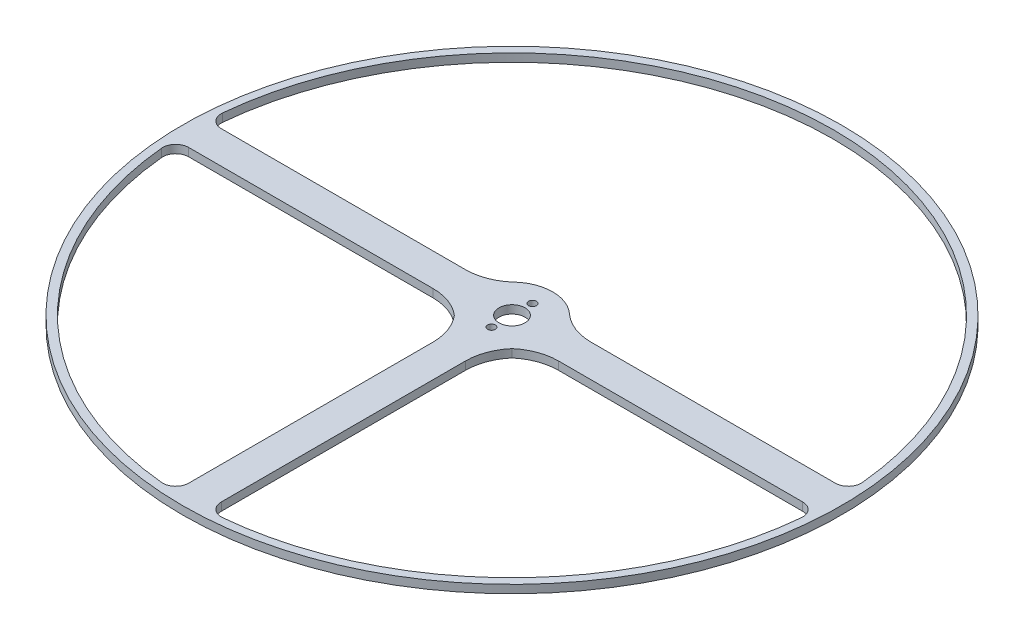
ISO-10303-21;
HEADER;
FILE_DESCRIPTION(('STEP AP214'),'2;1');
FILE_NAME('part.step','',(''),(''),'','','');
FILE_SCHEMA(('AUTOMOTIVE_DESIGN { 1 0 10303 214 1 1 1 1 }'));
ENDSEC;
DATA;
#1=APPLICATION_CONTEXT('core data for automotive mechanical design processes');
#2=APPLICATION_PROTOCOL_DEFINITION('international standard','automotive_design',2000,#1);
#3=PRODUCT_CONTEXT('',#1,'mechanical');
#4=PRODUCT('Part','Part','',(#3));
#5=PRODUCT_RELATED_PRODUCT_CATEGORY('part','',(#4));
#6=PRODUCT_DEFINITION_FORMATION('','',#4);
#7=PRODUCT_DEFINITION_CONTEXT('part definition',#1,'design');
#8=PRODUCT_DEFINITION('design','',#6,#7);
#9=PRODUCT_DEFINITION_SHAPE('','',#8);
#10=(LENGTH_UNIT() NAMED_UNIT(*) SI_UNIT(.MILLI.,.METRE.));
#11=(NAMED_UNIT(*) PLANE_ANGLE_UNIT() SI_UNIT($,.RADIAN.));
#12=(NAMED_UNIT(*) SI_UNIT($,.STERADIAN.) SOLID_ANGLE_UNIT());
#13=UNCERTAINTY_MEASURE_WITH_UNIT(LENGTH_MEASURE(1.E-05),#10,'distance_accuracy_value','');
#14=(GEOMETRIC_REPRESENTATION_CONTEXT(3) GLOBAL_UNCERTAINTY_ASSIGNED_CONTEXT((#13)) GLOBAL_UNIT_ASSIGNED_CONTEXT((#10,
#11,#12)) REPRESENTATION_CONTEXT('',''));
#15=CARTESIAN_POINT('',(0.,0.,0.));
#16=DIRECTION('',(0.,0.,1.));
#17=DIRECTION('',(1.,0.,0.));
#18=AXIS2_PLACEMENT_3D('',#15,#16,#17);
#19=CARTESIAN_POINT('',(0.,3.175,0.));
#20=DIRECTION('',(0.,1.,0.));
#21=DIRECTION('',(0.,0.,1.));
#22=AXIS2_PLACEMENT_3D('',#19,#20,#21);
#23=PLANE('',#22);
#24=CARTESIAN_POINT('',(0.,3.175,-8.));
#25=DIRECTION('',(0.,1.,0.));
#26=DIRECTION('',(0.,0.,1.));
#27=AXIS2_PLACEMENT_3D('',#24,#25,#26);
#28=CIRCLE('',#27,1.51329685617189);
#29=CARTESIAN_POINT('',(0.,3.175,-6.48670314382811));
#30=VERTEX_POINT('',#29);
#31=EDGE_CURVE('E200',#30,#30,#28,.T.);
#32=ORIENTED_EDGE('',*,*,#31,.F.);
#33=EDGE_LOOP('',(#32));
#34=FACE_BOUND('',#33,.T.);
#35=CARTESIAN_POINT('',(0.,3.175,8.));
#36=DIRECTION('',(0.,1.,0.));
#37=DIRECTION('',(0.,0.,1.));
#38=AXIS2_PLACEMENT_3D('',#35,#36,#37);
#39=CIRCLE('',#38,1.51329685617189);
#40=CARTESIAN_POINT('',(0.,3.175,9.51329685617189));
#41=VERTEX_POINT('',#40);
#42=EDGE_CURVE('E380',#41,#41,#39,.T.);
#43=ORIENTED_EDGE('',*,*,#42,.F.);
#44=EDGE_LOOP('',(#43));
#45=FACE_BOUND('',#44,.T.);
#46=CARTESIAN_POINT('',(0.,3.175,0.));
#47=DIRECTION('',(0.,1.,0.));
#48=DIRECTION('',(0.,0.,1.));
#49=AXIS2_PLACEMENT_3D('',#46,#47,#48);
#50=CIRCLE('',#49,5.08);
#51=CARTESIAN_POINT('',(0.,3.175,5.08));
#52=VERTEX_POINT('',#51);
#53=EDGE_CURVE('E374',#52,#52,#50,.T.);
#54=ORIENTED_EDGE('',*,*,#53,.F.);
#55=EDGE_LOOP('',(#54));
#56=FACE_BOUND('',#55,.T.);
#57=CARTESIAN_POINT('',(0.,3.175,0.));
#58=DIRECTION('',(0.,1.,0.));
#59=DIRECTION('',(0.,0.,1.));
#60=AXIS2_PLACEMENT_3D('',#57,#58,#59);
#61=CIRCLE('',#60,128.5748);
#62=CARTESIAN_POINT('',(0.,3.175,128.5748));
#63=VERTEX_POINT('',#62);
#64=EDGE_CURVE('E205',#63,#63,#61,.T.);
#65=ORIENTED_EDGE('',*,*,#64,.T.);
#66=EDGE_LOOP('',(#65));
#67=FACE_BOUND('',#66,.T.);
#68=DIRECTION('',(0.,0.,-1.));
#69=VECTOR('',#68,1.);
#70=CARTESIAN_POINT('',(-6.35,3.175,14.5496778314848));
#71=LINE('',#70,#69);
#72=CARTESIAN_POINT('',(-6.35,3.175,119.775662686708));
#73=VERTEX_POINT('',#72);
#74=CARTESIAN_POINT('',(-6.35,3.175,24.4701680623571));
#75=VERTEX_POINT('',#74);
#76=EDGE_CURVE('E323',#73,#75,#71,.T.);
#77=ORIENTED_EDGE('',*,*,#76,.F.);
#78=CARTESIAN_POINT('',(-11.43,3.175,119.775662686708));
#79=DIRECTION('',(0.,1.,0.));
#80=DIRECTION('',(0.,0.,1.));
#81=AXIS2_PLACEMENT_3D('',#78,#79,#80);
#82=CIRCLE('',#81,5.07999999999999);
#83=CARTESIAN_POINT('',(-11.9125839138695,3.175,124.832688765944));
#84=VERTEX_POINT('',#83);
#85=EDGE_CURVE('E296',#73,#84,#82,.F.);
#86=ORIENTED_EDGE('',*,*,#85,.T.);
#87=CARTESIAN_POINT('',(0.,3.175,0.));
#88=DIRECTION('',(0.,1.,0.));
#89=DIRECTION('',(0.,0.,1.));
#90=AXIS2_PLACEMENT_3D('',#87,#88,#89);
#91=CIRCLE('',#90,125.3998);
#92=CARTESIAN_POINT('',(-124.832688765944,3.175,11.9125839138695));
#93=VERTEX_POINT('',#92);
#94=EDGE_CURVE('E314',#93,#84,#91,.T.);
#95=ORIENTED_EDGE('',*,*,#94,.F.);
#96=CARTESIAN_POINT('',(-119.775662686708,3.175,11.43));
#97=DIRECTION('',(0.,1.,0.));
#98=DIRECTION('',(0.,0.,1.));
#99=AXIS2_PLACEMENT_3D('',#96,#97,#98);
#100=CIRCLE('',#99,5.07999999999999);
#101=CARTESIAN_POINT('',(-119.775662686708,3.175,6.35000000000001));
#102=VERTEX_POINT('',#101);
#103=EDGE_CURVE('E304',#93,#102,#100,.F.);
#104=ORIENTED_EDGE('',*,*,#103,.T.);
#105=DIRECTION('',(-1.,0.,0.));
#106=VECTOR('',#105,1.);
#107=CARTESIAN_POINT('',(-14.5496778314848,3.175,6.35));
#108=LINE('',#107,#106);
#109=CARTESIAN_POINT('',(-24.4701680623571,3.175,6.35));
#110=VERTEX_POINT('',#109);
#111=EDGE_CURVE('E312',#110,#102,#108,.T.);
#112=ORIENTED_EDGE('',*,*,#111,.F.);
#113=CARTESIAN_POINT('',(-24.4701680623571,3.175,26.67));
#114=DIRECTION('',(0.,1.,0.));
#115=DIRECTION('',(0.,0.,1.));
#116=AXIS2_PLACEMENT_3D('',#113,#114,#115);
#117=CIRCLE('',#116,20.32);
#118=CARTESIAN_POINT('',(-11.243835922845,3.175,11.2438359228449));
#119=VERTEX_POINT('',#118);
#120=EDGE_CURVE('E243',#110,#119,#117,.F.);
#121=ORIENTED_EDGE('',*,*,#120,.T.);
#122=CARTESIAN_POINT('',(-26.67,3.175,24.4701680623571));
#123=DIRECTION('',(0.,1.,0.));
#124=DIRECTION('',(0.,0.,1.));
#125=AXIS2_PLACEMENT_3D('',#122,#123,#124);
#126=CIRCLE('',#125,20.32);
#127=EDGE_CURVE('E247',#119,#75,#126,.F.);
#128=ORIENTED_EDGE('',*,*,#127,.T.);
#129=EDGE_LOOP('',(#77,#86,#95,#104,#112,#121,#128));
#130=FACE_BOUND('',#129,.T.);
#131=DIRECTION('',(-1.,0.,0.));
#132=VECTOR('',#131,1.);
#133=CARTESIAN_POINT('',(125.238921027131,3.175,6.34999999999998));
#134=LINE('',#133,#132);
#135=CARTESIAN_POINT('',(119.775662686708,3.175,6.34999999999998));
#136=VERTEX_POINT('',#135);
#137=CARTESIAN_POINT('',(24.4701680623571,3.175,6.34999999999999));
#138=VERTEX_POINT('',#137);
#139=EDGE_CURVE('E339',#136,#138,#134,.T.);
#140=ORIENTED_EDGE('',*,*,#139,.F.);
#141=CARTESIAN_POINT('',(119.775662686708,3.175,11.43));
#142=DIRECTION('',(0.,1.,0.));
#143=DIRECTION('',(0.,0.,1.));
#144=AXIS2_PLACEMENT_3D('',#141,#142,#143);
#145=CIRCLE('',#144,5.07999999999999);
#146=CARTESIAN_POINT('',(124.832688765944,3.175,11.9125839138695));
#147=VERTEX_POINT('',#146);
#148=EDGE_CURVE('E288',#136,#147,#145,.F.);
#149=ORIENTED_EDGE('',*,*,#148,.T.);
#150=CARTESIAN_POINT('',(0.,3.175,0.));
#151=DIRECTION('',(0.,1.,0.));
#152=DIRECTION('',(0.,0.,1.));
#153=AXIS2_PLACEMENT_3D('',#150,#151,#152);
#154=CIRCLE('',#153,125.3998);
#155=CARTESIAN_POINT('',(11.9125839138695,3.175,124.832688765944));
#156=VERTEX_POINT('',#155);
#157=EDGE_CURVE('E364',#156,#147,#154,.T.);
#158=ORIENTED_EDGE('',*,*,#157,.F.);
#159=CARTESIAN_POINT('',(11.43,3.175,119.775662686708));
#160=DIRECTION('',(0.,1.,0.));
#161=DIRECTION('',(0.,0.,1.));
#162=AXIS2_PLACEMENT_3D('',#159,#160,#161);
#163=CIRCLE('',#162,5.07999999999999);
#164=CARTESIAN_POINT('',(6.35,3.175,119.775662686708));
#165=VERTEX_POINT('',#164);
#166=EDGE_CURVE('E300',#156,#165,#163,.F.);
#167=ORIENTED_EDGE('',*,*,#166,.T.);
#168=DIRECTION('',(0.,0.,1.));
#169=VECTOR('',#168,1.);
#170=CARTESIAN_POINT('',(6.35000000000002,3.175,14.5496778314848));
#171=LINE('',#170,#169);
#172=CARTESIAN_POINT('',(6.35000000000002,3.175,24.470168062357));
#173=VERTEX_POINT('',#172);
#174=EDGE_CURVE('E335',#173,#165,#171,.T.);
#175=ORIENTED_EDGE('',*,*,#174,.F.);
#176=CARTESIAN_POINT('',(26.67,3.175,24.4701680623571));
#177=DIRECTION('',(0.,1.,0.));
#178=DIRECTION('',(0.,0.,1.));
#179=AXIS2_PLACEMENT_3D('',#176,#177,#178);
#180=CIRCLE('',#179,20.32);
#181=CARTESIAN_POINT('',(11.243835922845,3.175,11.2438359228449));
#182=VERTEX_POINT('',#181);
#183=EDGE_CURVE('E239',#173,#182,#180,.F.);
#184=ORIENTED_EDGE('',*,*,#183,.T.);
#185=CARTESIAN_POINT('',(24.4701680623571,3.175,26.67));
#186=DIRECTION('',(0.,1.,0.));
#187=DIRECTION('',(0.,0.,1.));
#188=AXIS2_PLACEMENT_3D('',#185,#186,#187);
#189=CIRCLE('',#188,20.32);
#190=EDGE_CURVE('E234',#182,#138,#189,.F.);
#191=ORIENTED_EDGE('',*,*,#190,.T.);
#192=EDGE_LOOP('',(#140,#149,#158,#167,#175,#184,#191));
#193=FACE_BOUND('',#192,.T.);
#194=DIRECTION('',(1.,0.,0.));
#195=VECTOR('',#194,1.);
#196=CARTESIAN_POINT('',(125.238921027131,3.175,-6.35000000000002));
#197=LINE('',#196,#195);
#198=CARTESIAN_POINT('',(24.4701680623571,3.175,-6.35));
#199=VERTEX_POINT('',#198);
#200=CARTESIAN_POINT('',(119.775662686708,3.175,-6.35000000000002));
#201=VERTEX_POINT('',#200);
#202=EDGE_CURVE('E357',#199,#201,#197,.T.);
#203=ORIENTED_EDGE('',*,*,#202,.F.);
#204=CARTESIAN_POINT('',(24.4701680623571,3.175,-26.67));
#205=DIRECTION('',(0.,1.,0.));
#206=DIRECTION('',(0.,0.,1.));
#207=AXIS2_PLACEMENT_3D('',#204,#205,#206);
#208=CIRCLE('',#207,20.32);
#209=CARTESIAN_POINT('',(10.732529851911,3.175,-11.6973684210526));
#210=VERTEX_POINT('',#209);
#211=EDGE_CURVE('E189',#199,#210,#208,.F.);
#212=ORIENTED_EDGE('',*,*,#211,.T.);
#213=CARTESIAN_POINT('',(0.,3.175,0.));
#214=DIRECTION('',(0.,-1.,0.));
#215=DIRECTION('',(0.,0.,1.));
#216=AXIS2_PLACEMENT_3D('',#213,#214,#215);
#217=CIRCLE('',#216,15.875);
#218=CARTESIAN_POINT('',(-10.732529851911,3.175,-11.6973684210526));
#219=VERTEX_POINT('',#218);
#220=EDGE_CURVE('E346',#219,#210,#217,.T.);
#221=ORIENTED_EDGE('',*,*,#220,.F.);
#222=CARTESIAN_POINT('',(-24.4701680623571,3.175,-26.67));
#223=DIRECTION('',(0.,1.,0.));
#224=DIRECTION('',(0.,0.,1.));
#225=AXIS2_PLACEMENT_3D('',#222,#223,#224);
#226=CIRCLE('',#225,20.32);
#227=CARTESIAN_POINT('',(-24.4701680623571,3.175,-6.35));
#228=VERTEX_POINT('',#227);
#229=EDGE_CURVE('E188',#219,#228,#226,.F.);
#230=ORIENTED_EDGE('',*,*,#229,.T.);
#231=DIRECTION('',(1.,0.,0.));
#232=VECTOR('',#231,1.);
#233=CARTESIAN_POINT('',(-14.5496778314848,3.175,-6.35));
#234=LINE('',#233,#232);
#235=CARTESIAN_POINT('',(-119.775662686708,3.175,-6.34999999999999));
#236=VERTEX_POINT('',#235);
#237=EDGE_CURVE('E351',#236,#228,#234,.T.);
#238=ORIENTED_EDGE('',*,*,#237,.F.);
#239=CARTESIAN_POINT('',(-119.775662686708,3.175,-11.43));
#240=DIRECTION('',(0.,1.,0.));
#241=DIRECTION('',(0.,0.,1.));
#242=AXIS2_PLACEMENT_3D('',#239,#240,#241);
#243=CIRCLE('',#242,5.07999999999999);
#244=CARTESIAN_POINT('',(-124.832688765944,3.175,-11.9125839138695));
#245=VERTEX_POINT('',#244);
#246=EDGE_CURVE('E11',#236,#245,#243,.F.);
#247=ORIENTED_EDGE('',*,*,#246,.T.);
#248=CARTESIAN_POINT('',(0.,3.175,0.));
#249=DIRECTION('',(0.,1.,0.));
#250=DIRECTION('',(0.,0.,1.));
#251=AXIS2_PLACEMENT_3D('',#248,#249,#250);
#252=CIRCLE('',#251,125.3998);
#253=CARTESIAN_POINT('',(124.832688765944,3.175,-11.9125839138696));
#254=VERTEX_POINT('',#253);
#255=EDGE_CURVE('E354',#254,#245,#252,.T.);
#256=ORIENTED_EDGE('',*,*,#255,.F.);
#257=CARTESIAN_POINT('',(119.775662686708,3.175,-11.43));
#258=DIRECTION('',(0.,1.,0.));
#259=DIRECTION('',(0.,0.,1.));
#260=AXIS2_PLACEMENT_3D('',#257,#258,#259);
#261=CIRCLE('',#260,5.07999999999999);
#262=EDGE_CURVE('E292',#254,#201,#261,.F.);
#263=ORIENTED_EDGE('',*,*,#262,.T.);
#264=EDGE_LOOP('',(#203,#212,#221,#230,#238,#247,#256,#263));
#265=FACE_BOUND('',#264,.T.);
#266=ADVANCED_FACE('F33',(#34,#45,#56,#67,#130,#193,#265),#23,.T.);
#267=CARTESIAN_POINT('',(0.,0.,0.));
#268=DIRECTION('',(0.,1.,0.));
#269=DIRECTION('',(0.,0.,1.));
#270=AXIS2_PLACEMENT_3D('',#267,#268,#269);
#271=PLANE('',#270);
#272=CARTESIAN_POINT('',(0.,0.,-8.));
#273=DIRECTION('',(0.,1.,0.));
#274=DIRECTION('',(0.,0.,1.));
#275=AXIS2_PLACEMENT_3D('',#272,#273,#274);
#276=CIRCLE('',#275,1.51329685617189);
#277=CARTESIAN_POINT('',(0.,0.,-6.48670314382811));
#278=VERTEX_POINT('',#277);
#279=EDGE_CURVE('E383',#278,#278,#276,.T.);
#280=ORIENTED_EDGE('',*,*,#279,.T.);
#281=EDGE_LOOP('',(#280));
#282=FACE_BOUND('',#281,.T.);
#283=CARTESIAN_POINT('',(0.,0.,8.));
#284=DIRECTION('',(0.,1.,0.));
#285=DIRECTION('',(0.,0.,1.));
#286=AXIS2_PLACEMENT_3D('',#283,#284,#285);
#287=CIRCLE('',#286,1.51329685617189);
#288=CARTESIAN_POINT('',(0.,0.,9.51329685617189));
#289=VERTEX_POINT('',#288);
#290=EDGE_CURVE('E377',#289,#289,#287,.T.);
#291=ORIENTED_EDGE('',*,*,#290,.T.);
#292=EDGE_LOOP('',(#291));
#293=FACE_BOUND('',#292,.T.);
#294=CARTESIAN_POINT('',(0.,0.,0.));
#295=DIRECTION('',(0.,1.,0.));
#296=DIRECTION('',(0.,0.,1.));
#297=AXIS2_PLACEMENT_3D('',#294,#295,#296);
#298=CIRCLE('',#297,5.08);
#299=CARTESIAN_POINT('',(0.,0.,5.08));
#300=VERTEX_POINT('',#299);
#301=EDGE_CURVE('E254',#300,#300,#298,.T.);
#302=ORIENTED_EDGE('',*,*,#301,.T.);
#303=EDGE_LOOP('',(#302));
#304=FACE_BOUND('',#303,.T.);
#305=DIRECTION('',(0.,0.,1.));
#306=VECTOR('',#305,1.);
#307=CARTESIAN_POINT('',(6.35000000000002,0.,14.5496778314848));
#308=LINE('',#307,#306);
#309=CARTESIAN_POINT('',(6.35000000000002,0.,24.470168062357));
#310=VERTEX_POINT('',#309);
#311=CARTESIAN_POINT('',(6.35,0.,119.775662686708));
#312=VERTEX_POINT('',#311);
#313=EDGE_CURVE('E361',#310,#312,#308,.T.);
#314=ORIENTED_EDGE('',*,*,#313,.T.);
#315=CARTESIAN_POINT('',(11.43,0.,119.775662686708));
#316=DIRECTION('',(0.,1.,0.));
#317=DIRECTION('',(0.,0.,1.));
#318=AXIS2_PLACEMENT_3D('',#315,#316,#317);
#319=CIRCLE('',#318,5.07999999999999);
#320=CARTESIAN_POINT('',(11.9125839138695,0.,124.832688765944));
#321=VERTEX_POINT('',#320);
#322=EDGE_CURVE('E298',#312,#321,#319,.T.);
#323=ORIENTED_EDGE('',*,*,#322,.T.);
#324=CARTESIAN_POINT('',(0.,0.,0.));
#325=DIRECTION('',(0.,1.,0.));
#326=DIRECTION('',(0.,0.,1.));
#327=AXIS2_PLACEMENT_3D('',#324,#325,#326);
#328=CIRCLE('',#327,125.3998);
#329=CARTESIAN_POINT('',(124.832688765944,0.,11.9125839138695));
#330=VERTEX_POINT('',#329);
#331=EDGE_CURVE('E353',#321,#330,#328,.T.);
#332=ORIENTED_EDGE('',*,*,#331,.T.);
#333=CARTESIAN_POINT('',(119.775662686708,0.,11.43));
#334=DIRECTION('',(0.,1.,0.));
#335=DIRECTION('',(0.,0.,1.));
#336=AXIS2_PLACEMENT_3D('',#333,#334,#335);
#337=CIRCLE('',#336,5.07999999999999);
#338=CARTESIAN_POINT('',(119.775662686708,0.,6.34999999999998));
#339=VERTEX_POINT('',#338);
#340=EDGE_CURVE('E286',#330,#339,#337,.T.);
#341=ORIENTED_EDGE('',*,*,#340,.T.);
#342=DIRECTION('',(-1.,0.,0.));
#343=VECTOR('',#342,1.);
#344=CARTESIAN_POINT('',(125.238921027131,0.,6.34999999999998));
#345=LINE('',#344,#343);
#346=CARTESIAN_POINT('',(24.4701680623571,0.,6.34999999999999));
#347=VERTEX_POINT('',#346);
#348=EDGE_CURVE('E365',#339,#347,#345,.T.);
#349=ORIENTED_EDGE('',*,*,#348,.T.);
#350=CARTESIAN_POINT('',(24.4701680623571,0.,26.67));
#351=DIRECTION('',(0.,1.,0.));
#352=DIRECTION('',(0.,0.,1.));
#353=AXIS2_PLACEMENT_3D('',#350,#351,#352);
#354=CIRCLE('',#353,20.32);
#355=CARTESIAN_POINT('',(11.243835922845,0.,11.2438359228449));
#356=VERTEX_POINT('',#355);
#357=EDGE_CURVE('E232',#347,#356,#354,.T.);
#358=ORIENTED_EDGE('',*,*,#357,.T.);
#359=CARTESIAN_POINT('',(26.67,0.,24.4701680623571));
#360=DIRECTION('',(0.,1.,0.));
#361=DIRECTION('',(0.,0.,1.));
#362=AXIS2_PLACEMENT_3D('',#359,#360,#361);
#363=CIRCLE('',#362,20.32);
#364=EDGE_CURVE('E237',#356,#310,#363,.T.);
#365=ORIENTED_EDGE('',*,*,#364,.T.);
#366=EDGE_LOOP('',(#314,#323,#332,#341,#349,#358,#365));
#367=FACE_BOUND('',#366,.T.);
#368=CARTESIAN_POINT('',(0.,0.,0.));
#369=DIRECTION('',(0.,1.,0.));
#370=DIRECTION('',(0.,0.,1.));
#371=AXIS2_PLACEMENT_3D('',#368,#369,#370);
#372=CIRCLE('',#371,128.5748);
#373=CARTESIAN_POINT('',(0.,0.,128.5748));
#374=VERTEX_POINT('',#373);
#375=EDGE_CURVE('E210',#374,#374,#372,.T.);
#376=ORIENTED_EDGE('',*,*,#375,.F.);
#377=EDGE_LOOP('',(#376));
#378=FACE_BOUND('',#377,.T.);
#379=DIRECTION('',(-1.,0.,0.));
#380=VECTOR('',#379,1.);
#381=CARTESIAN_POINT('',(-14.5496778314848,0.,6.35));
#382=LINE('',#381,#380);
#383=CARTESIAN_POINT('',(-24.4701680623571,0.,6.35));
#384=VERTEX_POINT('',#383);
#385=CARTESIAN_POINT('',(-119.775662686708,0.,6.35000000000001));
#386=VERTEX_POINT('',#385);
#387=EDGE_CURVE('E330',#384,#386,#382,.T.);
#388=ORIENTED_EDGE('',*,*,#387,.T.);
#389=CARTESIAN_POINT('',(-119.775662686708,0.,11.43));
#390=DIRECTION('',(0.,1.,0.));
#391=DIRECTION('',(0.,0.,1.));
#392=AXIS2_PLACEMENT_3D('',#389,#390,#391);
#393=CIRCLE('',#392,5.07999999999999);
#394=CARTESIAN_POINT('',(-124.832688765944,0.,11.9125839138695));
#395=VERTEX_POINT('',#394);
#396=EDGE_CURVE('E302',#386,#395,#393,.T.);
#397=ORIENTED_EDGE('',*,*,#396,.T.);
#398=CARTESIAN_POINT('',(0.,0.,0.));
#399=DIRECTION('',(0.,1.,0.));
#400=DIRECTION('',(0.,0.,1.));
#401=AXIS2_PLACEMENT_3D('',#398,#399,#400);
#402=CIRCLE('',#401,125.3998);
#403=CARTESIAN_POINT('',(-11.9125839138695,0.,124.832688765944));
#404=VERTEX_POINT('',#403);
#405=EDGE_CURVE('E329',#395,#404,#402,.T.);
#406=ORIENTED_EDGE('',*,*,#405,.T.);
#407=CARTESIAN_POINT('',(-11.43,0.,119.775662686708));
#408=DIRECTION('',(0.,1.,0.));
#409=DIRECTION('',(0.,0.,1.));
#410=AXIS2_PLACEMENT_3D('',#407,#408,#409);
#411=CIRCLE('',#410,5.07999999999999);
#412=CARTESIAN_POINT('',(-6.35,0.,119.775662686708));
#413=VERTEX_POINT('',#412);
#414=EDGE_CURVE('E294',#404,#413,#411,.T.);
#415=ORIENTED_EDGE('',*,*,#414,.T.);
#416=DIRECTION('',(0.,0.,-1.));
#417=VECTOR('',#416,1.);
#418=CARTESIAN_POINT('',(-6.35,0.,14.5496778314848));
#419=LINE('',#418,#417);
#420=CARTESIAN_POINT('',(-6.35,0.,24.4701680623571));
#421=VERTEX_POINT('',#420);
#422=EDGE_CURVE('E334',#413,#421,#419,.T.);
#423=ORIENTED_EDGE('',*,*,#422,.T.);
#424=CARTESIAN_POINT('',(-26.67,0.,24.4701680623571));
#425=DIRECTION('',(0.,1.,0.));
#426=DIRECTION('',(0.,0.,1.));
#427=AXIS2_PLACEMENT_3D('',#424,#425,#426);
#428=CIRCLE('',#427,20.32);
#429=CARTESIAN_POINT('',(-11.243835922845,0.,11.2438359228449));
#430=VERTEX_POINT('',#429);
#431=EDGE_CURVE('E245',#421,#430,#428,.T.);
#432=ORIENTED_EDGE('',*,*,#431,.T.);
#433=CARTESIAN_POINT('',(-24.4701680623571,0.,26.67));
#434=DIRECTION('',(0.,1.,0.));
#435=DIRECTION('',(0.,0.,1.));
#436=AXIS2_PLACEMENT_3D('',#433,#434,#435);
#437=CIRCLE('',#436,20.32);
#438=EDGE_CURVE('E241',#430,#384,#437,.T.);
#439=ORIENTED_EDGE('',*,*,#438,.T.);
#440=EDGE_LOOP('',(#388,#397,#406,#415,#423,#432,#439));
#441=FACE_BOUND('',#440,.T.);
#442=CARTESIAN_POINT('',(0.,0.,0.));
#443=DIRECTION('',(0.,1.,0.));
#444=DIRECTION('',(0.,0.,1.));
#445=AXIS2_PLACEMENT_3D('',#442,#443,#444);
#446=CIRCLE('',#445,125.3998);
#447=CARTESIAN_POINT('',(124.832688765944,0.,-11.9125839138696));
#448=VERTEX_POINT('',#447);
#449=CARTESIAN_POINT('',(-124.832688765944,0.,-11.9125839138695));
#450=VERTEX_POINT('',#449);
#451=EDGE_CURVE('E347',#448,#450,#446,.T.);
#452=ORIENTED_EDGE('',*,*,#451,.T.);
#453=CARTESIAN_POINT('',(-119.775662686708,0.,-11.43));
#454=DIRECTION('',(0.,1.,0.));
#455=DIRECTION('',(0.,0.,1.));
#456=AXIS2_PLACEMENT_3D('',#453,#454,#455);
#457=CIRCLE('',#456,5.07999999999999);
#458=CARTESIAN_POINT('',(-119.775662686708,0.,-6.34999999999999));
#459=VERTEX_POINT('',#458);
#460=EDGE_CURVE('E41',#450,#459,#457,.T.);
#461=ORIENTED_EDGE('',*,*,#460,.T.);
#462=DIRECTION('',(1.,0.,0.));
#463=VECTOR('',#462,1.);
#464=CARTESIAN_POINT('',(-14.5496778314848,0.,-6.35));
#465=LINE('',#464,#463);
#466=CARTESIAN_POINT('',(-24.4701680623571,0.,-6.35));
#467=VERTEX_POINT('',#466);
#468=EDGE_CURVE('E183',#459,#467,#465,.T.);
#469=ORIENTED_EDGE('',*,*,#468,.T.);
#470=CARTESIAN_POINT('',(-24.4701680623571,0.,-26.67));
#471=DIRECTION('',(0.,1.,0.));
#472=DIRECTION('',(0.,0.,1.));
#473=AXIS2_PLACEMENT_3D('',#470,#471,#472);
#474=CIRCLE('',#473,20.32);
#475=CARTESIAN_POINT('',(-10.732529851911,0.,-11.6973684210526));
#476=VERTEX_POINT('',#475);
#477=EDGE_CURVE('E179',#467,#476,#474,.T.);
#478=ORIENTED_EDGE('',*,*,#477,.T.);
#479=CARTESIAN_POINT('',(0.,0.,0.));
#480=DIRECTION('',(0.,-1.,0.));
#481=DIRECTION('',(0.,0.,1.));
#482=AXIS2_PLACEMENT_3D('',#479,#480,#481);
#483=CIRCLE('',#482,15.875);
#484=CARTESIAN_POINT('',(10.732529851911,0.,-11.6973684210526));
#485=VERTEX_POINT('',#484);
#486=EDGE_CURVE('E182',#476,#485,#483,.T.);
#487=ORIENTED_EDGE('',*,*,#486,.T.);
#488=CARTESIAN_POINT('',(24.4701680623571,0.,-26.67));
#489=DIRECTION('',(0.,1.,0.));
#490=DIRECTION('',(0.,0.,1.));
#491=AXIS2_PLACEMENT_3D('',#488,#489,#490);
#492=CIRCLE('',#491,20.32);
#493=CARTESIAN_POINT('',(24.4701680623571,0.,-6.35));
#494=VERTEX_POINT('',#493);
#495=EDGE_CURVE('E228',#485,#494,#492,.T.);
#496=ORIENTED_EDGE('',*,*,#495,.T.);
#497=DIRECTION('',(1.,0.,0.));
#498=VECTOR('',#497,1.);
#499=CARTESIAN_POINT('',(125.238921027131,0.,-6.35000000000002));
#500=LINE('',#499,#498);
#501=CARTESIAN_POINT('',(119.775662686708,0.,-6.35000000000002));
#502=VERTEX_POINT('',#501);
#503=EDGE_CURVE('E199',#494,#502,#500,.T.);
#504=ORIENTED_EDGE('',*,*,#503,.T.);
#505=CARTESIAN_POINT('',(119.775662686708,0.,-11.43));
#506=DIRECTION('',(0.,1.,0.));
#507=DIRECTION('',(0.,0.,1.));
#508=AXIS2_PLACEMENT_3D('',#505,#506,#507);
#509=CIRCLE('',#508,5.07999999999999);
#510=EDGE_CURVE('E290',#502,#448,#509,.T.);
#511=ORIENTED_EDGE('',*,*,#510,.T.);
#512=EDGE_LOOP('',(#452,#461,#469,#478,#487,#496,#504,#511));
#513=FACE_BOUND('',#512,.T.);
#514=ADVANCED_FACE('F181',(#282,#293,#304,#367,#378,#441,#513),#271,.F.);
#515=CARTESIAN_POINT('',(0.,3.175,0.));
#516=DIRECTION('',(0.,-1.,0.));
#517=DIRECTION('',(0.,0.,-1.));
#518=AXIS2_PLACEMENT_3D('',#515,#516,#517);
#519=CYLINDRICAL_SURFACE('',#518,128.5748);
#520=ORIENTED_EDGE('',*,*,#64,.F.);
#521=EDGE_LOOP('',(#520));
#522=FACE_BOUND('',#521,.T.);
#523=ORIENTED_EDGE('',*,*,#375,.T.);
#524=EDGE_LOOP('',(#523));
#525=FACE_BOUND('',#524,.T.);
#526=ADVANCED_FACE('F401',(#522,#525),#519,.T.);
#527=CARTESIAN_POINT('',(0.,3.175,0.));
#528=DIRECTION('',(0.,-1.,0.));
#529=DIRECTION('',(0.,0.,-1.));
#530=AXIS2_PLACEMENT_3D('',#527,#528,#529);
#531=CYLINDRICAL_SURFACE('',#530,125.3998);
#532=ORIENTED_EDGE('',*,*,#94,.T.);
#533=DIRECTION('',(0.,-1.,0.));
#534=VECTOR('',#533,1.);
#535=CARTESIAN_POINT('',(-11.9125839138695,3.175,124.832688765944));
#536=LINE('',#535,#534);
#537=EDGE_CURVE('E274',#84,#404,#536,.T.);
#538=ORIENTED_EDGE('',*,*,#537,.T.);
#539=ORIENTED_EDGE('',*,*,#405,.F.);
#540=DIRECTION('',(0.,-1.,0.));
#541=VECTOR('',#540,1.);
#542=CARTESIAN_POINT('',(-124.832688765944,3.175,11.9125839138695));
#543=LINE('',#542,#541);
#544=EDGE_CURVE('E272',#395,#93,#543,.F.);
#545=ORIENTED_EDGE('',*,*,#544,.T.);
#546=EDGE_LOOP('',(#532,#538,#539,#545));
#547=FACE_BOUND('',#546,.T.);
#548=ADVANCED_FACE('F332',(#547),#531,.F.);
#549=CARTESIAN_POINT('',(-6.35,3.175,14.5496778314848));
#550=DIRECTION('',(-1.,0.,0.));
#551=DIRECTION('',(0.,0.,1.));
#552=AXIS2_PLACEMENT_3D('',#549,#550,#551);
#553=PLANE('',#552);
#554=ORIENTED_EDGE('',*,*,#422,.F.);
#555=DIRECTION('',(0.,1.,0.));
#556=VECTOR('',#555,1.);
#557=CARTESIAN_POINT('',(-6.35,3.175,119.775662686708));
#558=LINE('',#557,#556);
#559=EDGE_CURVE('E277',#413,#73,#558,.T.);
#560=ORIENTED_EDGE('',*,*,#559,.T.);
#561=ORIENTED_EDGE('',*,*,#76,.T.);
#562=DIRECTION('',(0.,1.,0.));
#563=VECTOR('',#562,1.);
#564=CARTESIAN_POINT('',(-6.35,0.,24.4701680623571));
#565=LINE('',#564,#563);
#566=EDGE_CURVE('E225',#75,#421,#565,.F.);
#567=ORIENTED_EDGE('',*,*,#566,.T.);
#568=EDGE_LOOP('',(#554,#560,#561,#567));
#569=FACE_BOUND('',#568,.T.);
#570=ADVANCED_FACE('F499',(#569),#553,.T.);
#571=CARTESIAN_POINT('',(-14.5496778314848,3.175,6.35));
#572=DIRECTION('',(0.,0.,1.));
#573=DIRECTION('',(1.,0.,0.));
#574=AXIS2_PLACEMENT_3D('',#571,#572,#573);
#575=PLANE('',#574);
#576=ORIENTED_EDGE('',*,*,#111,.T.);
#577=DIRECTION('',(0.,1.,0.));
#578=VECTOR('',#577,1.);
#579=CARTESIAN_POINT('',(-119.775662686708,0.,6.35000000000001));
#580=LINE('',#579,#578);
#581=EDGE_CURVE('E282',#102,#386,#580,.F.);
#582=ORIENTED_EDGE('',*,*,#581,.T.);
#583=ORIENTED_EDGE('',*,*,#387,.F.);
#584=DIRECTION('',(0.,1.,0.));
#585=VECTOR('',#584,1.);
#586=CARTESIAN_POINT('',(-24.4701680623571,3.175,6.35));
#587=LINE('',#586,#585);
#588=EDGE_CURVE('E222',#384,#110,#587,.T.);
#589=ORIENTED_EDGE('',*,*,#588,.T.);
#590=EDGE_LOOP('',(#576,#582,#583,#589));
#591=FACE_BOUND('',#590,.T.);
#592=ADVANCED_FACE('F319',(#591),#575,.T.);
#593=CARTESIAN_POINT('',(0.,3.175,0.));
#594=DIRECTION('',(0.,-1.,0.));
#595=DIRECTION('',(0.,0.,-1.));
#596=AXIS2_PLACEMENT_3D('',#593,#594,#595);
#597=CYLINDRICAL_SURFACE('',#596,125.3998);
#598=ORIENTED_EDGE('',*,*,#157,.T.);
#599=DIRECTION('',(0.,-1.,0.));
#600=VECTOR('',#599,1.);
#601=CARTESIAN_POINT('',(124.832688765944,3.175,11.9125839138695));
#602=LINE('',#601,#600);
#603=EDGE_CURVE('E259',#147,#330,#602,.T.);
#604=ORIENTED_EDGE('',*,*,#603,.T.);
#605=ORIENTED_EDGE('',*,*,#331,.F.);
#606=DIRECTION('',(0.,-1.,0.));
#607=VECTOR('',#606,1.);
#608=CARTESIAN_POINT('',(11.9125839138695,3.175,124.832688765944));
#609=LINE('',#608,#607);
#610=EDGE_CURVE('E250',#321,#156,#609,.F.);
#611=ORIENTED_EDGE('',*,*,#610,.T.);
#612=EDGE_LOOP('',(#598,#604,#605,#611));
#613=FACE_BOUND('',#612,.T.);
#614=ADVANCED_FACE('F489',(#613),#597,.F.);
#615=CARTESIAN_POINT('',(125.238921027131,3.175,6.34999999999998));
#616=DIRECTION('',(0.,0.,1.));
#617=DIRECTION('',(1.,0.,0.));
#618=AXIS2_PLACEMENT_3D('',#615,#616,#617);
#619=PLANE('',#618);
#620=ORIENTED_EDGE('',*,*,#348,.F.);
#621=DIRECTION('',(0.,1.,0.));
#622=VECTOR('',#621,1.);
#623=CARTESIAN_POINT('',(119.775662686708,3.175,6.34999999999998));
#624=LINE('',#623,#622);
#625=EDGE_CURVE('E262',#339,#136,#624,.T.);
#626=ORIENTED_EDGE('',*,*,#625,.T.);
#627=ORIENTED_EDGE('',*,*,#139,.T.);
#628=DIRECTION('',(0.,1.,0.));
#629=VECTOR('',#628,1.);
#630=CARTESIAN_POINT('',(24.4701680623571,0.,6.34999999999999));
#631=LINE('',#630,#629);
#632=EDGE_CURVE('E217',#138,#347,#631,.F.);
#633=ORIENTED_EDGE('',*,*,#632,.T.);
#634=EDGE_LOOP('',(#620,#626,#627,#633));
#635=FACE_BOUND('',#634,.T.);
#636=ADVANCED_FACE('F521',(#635),#619,.T.);
#637=CARTESIAN_POINT('',(6.35000000000002,3.175,14.5496778314848));
#638=DIRECTION('',(1.,0.,0.));
#639=DIRECTION('',(0.,0.,-1.));
#640=AXIS2_PLACEMENT_3D('',#637,#638,#639);
#641=PLANE('',#640);
#642=ORIENTED_EDGE('',*,*,#174,.T.);
#643=DIRECTION('',(0.,1.,0.));
#644=VECTOR('',#643,1.);
#645=CARTESIAN_POINT('',(6.35,0.,119.775662686708));
#646=LINE('',#645,#644);
#647=EDGE_CURVE('E279',#165,#312,#646,.F.);
#648=ORIENTED_EDGE('',*,*,#647,.T.);
#649=ORIENTED_EDGE('',*,*,#313,.F.);
#650=DIRECTION('',(0.,1.,0.));
#651=VECTOR('',#650,1.);
#652=CARTESIAN_POINT('',(6.35000000000002,3.175,24.470168062357));
#653=LINE('',#652,#651);
#654=EDGE_CURVE('E220',#310,#173,#653,.T.);
#655=ORIENTED_EDGE('',*,*,#654,.T.);
#656=EDGE_LOOP('',(#642,#648,#649,#655));
#657=FACE_BOUND('',#656,.T.);
#658=ADVANCED_FACE('F496',(#657),#641,.T.);
#659=CARTESIAN_POINT('',(0.,3.175,0.));
#660=DIRECTION('',(0.,-1.,0.));
#661=DIRECTION('',(0.,0.,-1.));
#662=AXIS2_PLACEMENT_3D('',#659,#660,#661);
#663=CYLINDRICAL_SURFACE('',#662,15.875);
#664=ORIENTED_EDGE('',*,*,#220,.T.);
#665=DIRECTION('',(0.,-1.,0.));
#666=VECTOR('',#665,1.);
#667=CARTESIAN_POINT('',(10.732529851911,3.175,-11.6973684210526));
#668=LINE('',#667,#666);
#669=EDGE_CURVE('E198',#210,#485,#668,.T.);
#670=ORIENTED_EDGE('',*,*,#669,.T.);
#671=ORIENTED_EDGE('',*,*,#486,.F.);
#672=DIRECTION('',(0.,-1.,0.));
#673=VECTOR('',#672,1.);
#674=CARTESIAN_POINT('',(-10.732529851911,3.175,-11.6973684210526));
#675=LINE('',#674,#673);
#676=EDGE_CURVE('E195',#476,#219,#675,.F.);
#677=ORIENTED_EDGE('',*,*,#676,.T.);
#678=EDGE_LOOP('',(#664,#670,#671,#677));
#679=FACE_BOUND('',#678,.T.);
#680=ADVANCED_FACE('F194',(#679),#663,.T.);
#681=CARTESIAN_POINT('',(125.238921027131,3.175,-6.35000000000002));
#682=DIRECTION('',(0.,0.,-1.));
#683=DIRECTION('',(-1.,0.,0.));
#684=AXIS2_PLACEMENT_3D('',#681,#682,#683);
#685=PLANE('',#684);
#686=ORIENTED_EDGE('',*,*,#202,.T.);
#687=DIRECTION('',(0.,1.,0.));
#688=VECTOR('',#687,1.);
#689=CARTESIAN_POINT('',(119.775662686708,0.,-6.35000000000002));
#690=LINE('',#689,#688);
#691=EDGE_CURVE('E264',#201,#502,#690,.F.);
#692=ORIENTED_EDGE('',*,*,#691,.T.);
#693=ORIENTED_EDGE('',*,*,#503,.F.);
#694=DIRECTION('',(0.,1.,0.));
#695=VECTOR('',#694,1.);
#696=CARTESIAN_POINT('',(24.4701680623571,3.175,-6.35));
#697=LINE('',#696,#695);
#698=EDGE_CURVE('E207',#494,#199,#697,.T.);
#699=ORIENTED_EDGE('',*,*,#698,.T.);
#700=EDGE_LOOP('',(#686,#692,#693,#699));
#701=FACE_BOUND('',#700,.T.);
#702=ADVANCED_FACE('F473',(#701),#685,.T.);
#703=CARTESIAN_POINT('',(0.,3.175,0.));
#704=DIRECTION('',(0.,-1.,0.));
#705=DIRECTION('',(0.,0.,-1.));
#706=AXIS2_PLACEMENT_3D('',#703,#704,#705);
#707=CYLINDRICAL_SURFACE('',#706,125.3998);
#708=ORIENTED_EDGE('',*,*,#451,.F.);
#709=DIRECTION('',(0.,-1.,0.));
#710=VECTOR('',#709,1.);
#711=CARTESIAN_POINT('',(124.832688765944,3.175,-11.9125839138696));
#712=LINE('',#711,#710);
#713=EDGE_CURVE('E270',#448,#254,#712,.F.);
#714=ORIENTED_EDGE('',*,*,#713,.T.);
#715=ORIENTED_EDGE('',*,*,#255,.T.);
#716=DIRECTION('',(0.,-1.,0.));
#717=VECTOR('',#716,1.);
#718=CARTESIAN_POINT('',(-124.832688765944,3.175,-11.9125839138695));
#719=LINE('',#718,#717);
#720=EDGE_CURVE('E267',#245,#450,#719,.T.);
#721=ORIENTED_EDGE('',*,*,#720,.T.);
#722=EDGE_LOOP('',(#708,#714,#715,#721));
#723=FACE_BOUND('',#722,.T.);
#724=ADVANCED_FACE('F468',(#723),#707,.F.);
#725=CARTESIAN_POINT('',(-14.5496778314848,3.175,-6.35));
#726=DIRECTION('',(0.,0.,-1.));
#727=DIRECTION('',(-1.,0.,0.));
#728=AXIS2_PLACEMENT_3D('',#725,#726,#727);
#729=PLANE('',#728);
#730=ORIENTED_EDGE('',*,*,#468,.F.);
#731=DIRECTION('',(0.,1.,0.));
#732=VECTOR('',#731,1.);
#733=CARTESIAN_POINT('',(-119.775662686708,3.175,-6.34999999999999));
#734=LINE('',#733,#732);
#735=EDGE_CURVE('E54',#459,#236,#734,.T.);
#736=ORIENTED_EDGE('',*,*,#735,.T.);
#737=ORIENTED_EDGE('',*,*,#237,.T.);
#738=DIRECTION('',(0.,1.,0.));
#739=VECTOR('',#738,1.);
#740=CARTESIAN_POINT('',(-24.4701680623571,0.,-6.35));
#741=LINE('',#740,#739);
#742=EDGE_CURVE('E215',#228,#467,#741,.F.);
#743=ORIENTED_EDGE('',*,*,#742,.T.);
#744=EDGE_LOOP('',(#730,#736,#737,#743));
#745=FACE_BOUND('',#744,.T.);
#746=ADVANCED_FACE('F476',(#745),#729,.T.);
#747=CARTESIAN_POINT('',(0.,3.175,0.));
#748=DIRECTION('',(0.,-1.,0.));
#749=DIRECTION('',(0.,0.,-1.));
#750=AXIS2_PLACEMENT_3D('',#747,#748,#749);
#751=CYLINDRICAL_SURFACE('',#750,5.08);
#752=ORIENTED_EDGE('',*,*,#53,.T.);
#753=EDGE_LOOP('',(#752));
#754=FACE_BOUND('',#753,.T.);
#755=ORIENTED_EDGE('',*,*,#301,.F.);
#756=EDGE_LOOP('',(#755));
#757=FACE_BOUND('',#756,.T.);
#758=ADVANCED_FACE('F478',(#754,#757),#751,.F.);
#759=CARTESIAN_POINT('',(0.,3.175,8.));
#760=DIRECTION('',(0.,-1.,0.));
#761=DIRECTION('',(0.,0.,-1.));
#762=AXIS2_PLACEMENT_3D('',#759,#760,#761);
#763=CYLINDRICAL_SURFACE('',#762,1.51329685617189);
#764=ORIENTED_EDGE('',*,*,#42,.T.);
#765=EDGE_LOOP('',(#764));
#766=FACE_BOUND('',#765,.T.);
#767=ORIENTED_EDGE('',*,*,#290,.F.);
#768=EDGE_LOOP('',(#767));
#769=FACE_BOUND('',#768,.T.);
#770=ADVANCED_FACE('F484',(#766,#769),#763,.F.);
#771=CARTESIAN_POINT('',(0.,3.175,-8.));
#772=DIRECTION('',(0.,-1.,0.));
#773=DIRECTION('',(0.,0.,-1.));
#774=AXIS2_PLACEMENT_3D('',#771,#772,#773);
#775=CYLINDRICAL_SURFACE('',#774,1.51329685617189);
#776=ORIENTED_EDGE('',*,*,#31,.T.);
#777=EDGE_LOOP('',(#776));
#778=FACE_BOUND('',#777,.T.);
#779=ORIENTED_EDGE('',*,*,#279,.F.);
#780=EDGE_LOOP('',(#779));
#781=FACE_BOUND('',#780,.T.);
#782=ADVANCED_FACE('F389',(#778,#781),#775,.F.);
#783=CARTESIAN_POINT('',(24.4701680623571,3.175,-26.67));
#784=DIRECTION('',(0.,-1.,0.));
#785=DIRECTION('',(0.,0.,-1.));
#786=AXIS2_PLACEMENT_3D('',#783,#784,#785);
#787=CYLINDRICAL_SURFACE('',#786,20.32);
#788=ORIENTED_EDGE('',*,*,#211,.F.);
#789=ORIENTED_EDGE('',*,*,#698,.F.);
#790=ORIENTED_EDGE('',*,*,#495,.F.);
#791=ORIENTED_EDGE('',*,*,#669,.F.);
#792=EDGE_LOOP('',(#788,#789,#790,#791));
#793=FACE_BOUND('',#792,.T.);
#794=ADVANCED_FACE('F416',(#793),#787,.F.);
#795=CARTESIAN_POINT('',(-24.4701680623571,3.175,-26.67));
#796=DIRECTION('',(0.,-1.,0.));
#797=DIRECTION('',(0.,0.,-1.));
#798=AXIS2_PLACEMENT_3D('',#795,#796,#797);
#799=CYLINDRICAL_SURFACE('',#798,20.32);
#800=ORIENTED_EDGE('',*,*,#229,.F.);
#801=ORIENTED_EDGE('',*,*,#676,.F.);
#802=ORIENTED_EDGE('',*,*,#477,.F.);
#803=ORIENTED_EDGE('',*,*,#742,.F.);
#804=EDGE_LOOP('',(#800,#801,#802,#803));
#805=FACE_BOUND('',#804,.T.);
#806=ADVANCED_FACE('F203',(#805),#799,.F.);
#807=CARTESIAN_POINT('',(26.67,3.175,24.4701680623571));
#808=DIRECTION('',(0.,-1.,0.));
#809=DIRECTION('',(0.,0.,-1.));
#810=AXIS2_PLACEMENT_3D('',#807,#808,#809);
#811=CYLINDRICAL_SURFACE('',#810,20.32);
#812=DIRECTION('',(0.,-1.,0.));
#813=VECTOR('',#812,1.);
#814=CARTESIAN_POINT('',(11.243835922845,1.5875,11.2438359228449));
#815=LINE('',#814,#813);
#816=EDGE_CURVE('E251',#182,#356,#815,.T.);
#817=ORIENTED_EDGE('',*,*,#816,.F.);
#818=ORIENTED_EDGE('',*,*,#183,.F.);
#819=ORIENTED_EDGE('',*,*,#654,.F.);
#820=ORIENTED_EDGE('',*,*,#364,.F.);
#821=EDGE_LOOP('',(#817,#818,#819,#820));
#822=FACE_BOUND('',#821,.T.);
#823=ADVANCED_FACE('F422',(#822),#811,.F.);
#824=CARTESIAN_POINT('',(24.4701680623571,3.175,26.67));
#825=DIRECTION('',(0.,-1.,0.));
#826=DIRECTION('',(0.,0.,-1.));
#827=AXIS2_PLACEMENT_3D('',#824,#825,#826);
#828=CYLINDRICAL_SURFACE('',#827,20.32);
#829=ORIENTED_EDGE('',*,*,#190,.F.);
#830=ORIENTED_EDGE('',*,*,#816,.T.);
#831=ORIENTED_EDGE('',*,*,#357,.F.);
#832=ORIENTED_EDGE('',*,*,#632,.F.);
#833=EDGE_LOOP('',(#829,#830,#831,#832));
#834=FACE_BOUND('',#833,.T.);
#835=ADVANCED_FACE('F423',(#834),#828,.F.);
#836=CARTESIAN_POINT('',(-26.67,3.175,24.4701680623571));
#837=DIRECTION('',(0.,-1.,0.));
#838=DIRECTION('',(0.,0.,-1.));
#839=AXIS2_PLACEMENT_3D('',#836,#837,#838);
#840=CYLINDRICAL_SURFACE('',#839,20.32);
#841=ORIENTED_EDGE('',*,*,#566,.F.);
#842=ORIENTED_EDGE('',*,*,#127,.F.);
#843=DIRECTION('',(0.,-1.,0.));
#844=VECTOR('',#843,1.);
#845=CARTESIAN_POINT('',(-11.243835922845,1.5875,11.243835922845));
#846=LINE('',#845,#844);
#847=EDGE_CURVE('E255',#430,#119,#846,.F.);
#848=ORIENTED_EDGE('',*,*,#847,.F.);
#849=ORIENTED_EDGE('',*,*,#431,.F.);
#850=EDGE_LOOP('',(#841,#842,#848,#849));
#851=FACE_BOUND('',#850,.T.);
#852=ADVANCED_FACE('F426',(#851),#840,.F.);
#853=CARTESIAN_POINT('',(-24.4701680623571,3.175,26.67));
#854=DIRECTION('',(0.,-1.,0.));
#855=DIRECTION('',(0.,0.,-1.));
#856=AXIS2_PLACEMENT_3D('',#853,#854,#855);
#857=CYLINDRICAL_SURFACE('',#856,20.32);
#858=ORIENTED_EDGE('',*,*,#120,.F.);
#859=ORIENTED_EDGE('',*,*,#588,.F.);
#860=ORIENTED_EDGE('',*,*,#438,.F.);
#861=ORIENTED_EDGE('',*,*,#847,.T.);
#862=EDGE_LOOP('',(#858,#859,#860,#861));
#863=FACE_BOUND('',#862,.T.);
#864=ADVANCED_FACE('F431',(#863),#857,.F.);
#865=CARTESIAN_POINT('',(119.775662686708,3.175,11.43));
#866=DIRECTION('',(0.,-1.,0.));
#867=DIRECTION('',(0.,0.,-1.));
#868=AXIS2_PLACEMENT_3D('',#865,#866,#867);
#869=CYLINDRICAL_SURFACE('',#868,5.07999999999999);
#870=ORIENTED_EDGE('',*,*,#148,.F.);
#871=ORIENTED_EDGE('',*,*,#625,.F.);
#872=ORIENTED_EDGE('',*,*,#340,.F.);
#873=ORIENTED_EDGE('',*,*,#603,.F.);
#874=EDGE_LOOP('',(#870,#871,#872,#873));
#875=FACE_BOUND('',#874,.T.);
#876=ADVANCED_FACE('F434',(#875),#869,.F.);
#877=CARTESIAN_POINT('',(119.775662686708,3.175,-11.43));
#878=DIRECTION('',(0.,-1.,0.));
#879=DIRECTION('',(0.,0.,-1.));
#880=AXIS2_PLACEMENT_3D('',#877,#878,#879);
#881=CYLINDRICAL_SURFACE('',#880,5.07999999999999);
#882=ORIENTED_EDGE('',*,*,#262,.F.);
#883=ORIENTED_EDGE('',*,*,#713,.F.);
#884=ORIENTED_EDGE('',*,*,#510,.F.);
#885=ORIENTED_EDGE('',*,*,#691,.F.);
#886=EDGE_LOOP('',(#882,#883,#884,#885));
#887=FACE_BOUND('',#886,.T.);
#888=ADVANCED_FACE('F441',(#887),#881,.F.);
#889=CARTESIAN_POINT('',(-11.43,3.175,119.775662686708));
#890=DIRECTION('',(0.,-1.,0.));
#891=DIRECTION('',(0.,0.,-1.));
#892=AXIS2_PLACEMENT_3D('',#889,#890,#891);
#893=CYLINDRICAL_SURFACE('',#892,5.07999999999999);
#894=ORIENTED_EDGE('',*,*,#85,.F.);
#895=ORIENTED_EDGE('',*,*,#559,.F.);
#896=ORIENTED_EDGE('',*,*,#414,.F.);
#897=ORIENTED_EDGE('',*,*,#537,.F.);
#898=EDGE_LOOP('',(#894,#895,#896,#897));
#899=FACE_BOUND('',#898,.T.);
#900=ADVANCED_FACE('F445',(#899),#893,.F.);
#901=CARTESIAN_POINT('',(11.43,3.175,119.775662686708));
#902=DIRECTION('',(0.,-1.,0.));
#903=DIRECTION('',(0.,0.,-1.));
#904=AXIS2_PLACEMENT_3D('',#901,#902,#903);
#905=CYLINDRICAL_SURFACE('',#904,5.07999999999999);
#906=ORIENTED_EDGE('',*,*,#166,.F.);
#907=ORIENTED_EDGE('',*,*,#610,.F.);
#908=ORIENTED_EDGE('',*,*,#322,.F.);
#909=ORIENTED_EDGE('',*,*,#647,.F.);
#910=EDGE_LOOP('',(#906,#907,#908,#909));
#911=FACE_BOUND('',#910,.T.);
#912=ADVANCED_FACE('F449',(#911),#905,.F.);
#913=CARTESIAN_POINT('',(-119.775662686708,3.175,11.43));
#914=DIRECTION('',(0.,-1.,0.));
#915=DIRECTION('',(0.,0.,-1.));
#916=AXIS2_PLACEMENT_3D('',#913,#914,#915);
#917=CYLINDRICAL_SURFACE('',#916,5.07999999999999);
#918=ORIENTED_EDGE('',*,*,#103,.F.);
#919=ORIENTED_EDGE('',*,*,#544,.F.);
#920=ORIENTED_EDGE('',*,*,#396,.F.);
#921=ORIENTED_EDGE('',*,*,#581,.F.);
#922=EDGE_LOOP('',(#918,#919,#920,#921));
#923=FACE_BOUND('',#922,.T.);
#924=ADVANCED_FACE('F325',(#923),#917,.F.);
#925=CARTESIAN_POINT('',(-119.775662686708,3.175,-11.43));
#926=DIRECTION('',(0.,-1.,0.));
#927=DIRECTION('',(0.,0.,-1.));
#928=AXIS2_PLACEMENT_3D('',#925,#926,#927);
#929=CYLINDRICAL_SURFACE('',#928,5.07999999999999);
#930=ORIENTED_EDGE('',*,*,#246,.F.);
#931=ORIENTED_EDGE('',*,*,#735,.F.);
#932=ORIENTED_EDGE('',*,*,#460,.F.);
#933=ORIENTED_EDGE('',*,*,#720,.F.);
#934=EDGE_LOOP('',(#930,#931,#932,#933));
#935=FACE_BOUND('',#934,.T.);
#936=ADVANCED_FACE('F35',(#935),#929,.F.);
#937=CLOSED_SHELL('',(#266,#514,#526,#548,#570,#592,#614,#636,#658,#680,#702,#724,#746,#758,
#770,#782,#794,#806,#823,#835,#852,#864,#876,#888,#900,#912,#924,#936));
#938=MANIFOLD_SOLID_BREP('B2',#937);
#939=ADVANCED_BREP_SHAPE_REPRESENTATION('',(#18,#938),#14);
#940=SHAPE_DEFINITION_REPRESENTATION(#9,#939);
ENDSEC;
END-ISO-10303-21;
